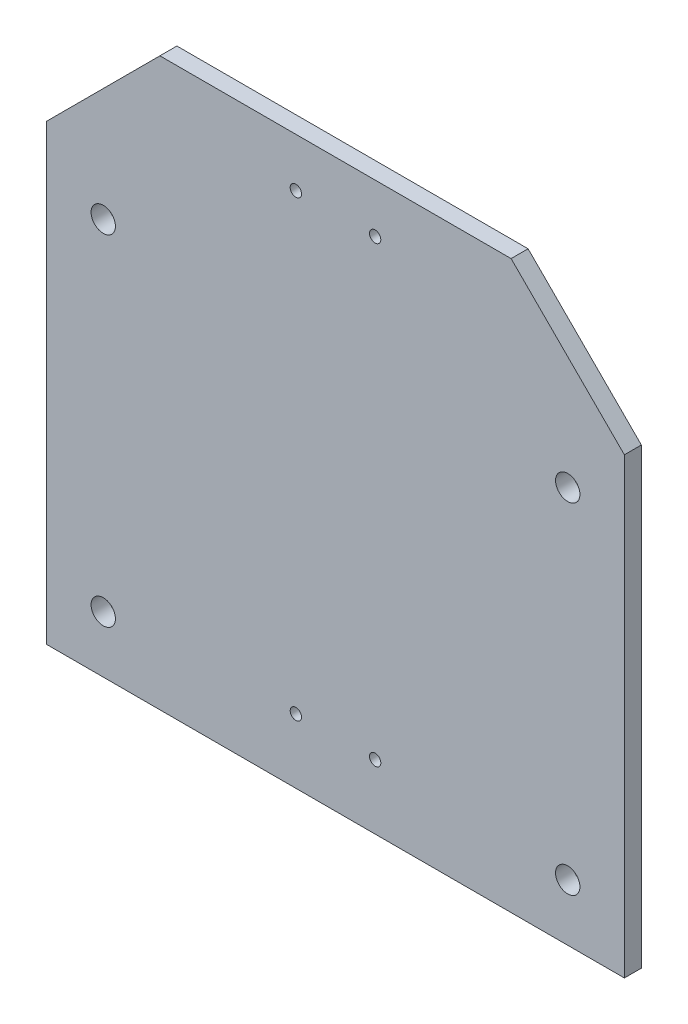
ISO-10303-21;
HEADER;
FILE_DESCRIPTION(('STEP AP214'),'2;1');
FILE_NAME('part.step','',(''),(''),'','','');
FILE_SCHEMA(('AUTOMOTIVE_DESIGN { 1 0 10303 214 1 1 1 1 }'));
ENDSEC;
DATA;
#1=APPLICATION_CONTEXT('core data for automotive mechanical design processes');
#2=APPLICATION_PROTOCOL_DEFINITION('international standard','automotive_design',2000,#1);
#3=PRODUCT_CONTEXT('',#1,'mechanical');
#4=PRODUCT('Part','Part','',(#3));
#5=PRODUCT_RELATED_PRODUCT_CATEGORY('part','',(#4));
#6=PRODUCT_DEFINITION_FORMATION('','',#4);
#7=PRODUCT_DEFINITION_CONTEXT('part definition',#1,'design');
#8=PRODUCT_DEFINITION('design','',#6,#7);
#9=PRODUCT_DEFINITION_SHAPE('','',#8);
#10=(LENGTH_UNIT() NAMED_UNIT(*) SI_UNIT(.MILLI.,.METRE.));
#11=(NAMED_UNIT(*) PLANE_ANGLE_UNIT() SI_UNIT($,.RADIAN.));
#12=(NAMED_UNIT(*) SI_UNIT($,.STERADIAN.) SOLID_ANGLE_UNIT());
#13=UNCERTAINTY_MEASURE_WITH_UNIT(LENGTH_MEASURE(1.E-05),#10,'distance_accuracy_value','');
#14=(GEOMETRIC_REPRESENTATION_CONTEXT(3) GLOBAL_UNCERTAINTY_ASSIGNED_CONTEXT((#13)) GLOBAL_UNIT_ASSIGNED_CONTEXT((#10,
#11,#12)) REPRESENTATION_CONTEXT('',''));
#15=CARTESIAN_POINT('',(0.,0.,0.));
#16=DIRECTION('',(0.,0.,1.));
#17=DIRECTION('',(1.,0.,0.));
#18=AXIS2_PLACEMENT_3D('',#15,#16,#17);
#19=CARTESIAN_POINT('',(-51.0025000000016,19.8724612873921,-3.));
#20=DIRECTION('',(-1.,-2.76341449723146E-13,0.));
#21=DIRECTION('',(2.76341449723146E-13,-1.,0.));
#22=AXIS2_PLACEMENT_3D('',#19,#20,#21);
#23=PLANE('',#22);
#24=DIRECTION('',(2.76341449723146E-13,-1.,0.));
#25=VECTOR('',#24,1.);
#26=CARTESIAN_POINT('',(-51.0025000000016,19.8724612873921,0.));
#27=LINE('',#26,#25);
#28=CARTESIAN_POINT('',(-51.0025000000016,19.8724612873921,0.));
#29=VERTEX_POINT('',#28);
#30=CARTESIAN_POINT('',(-51.0024999999795,-60.1275387125962,0.));
#31=VERTEX_POINT('',#30);
#32=EDGE_CURVE('E121',#29,#31,#27,.T.);
#33=ORIENTED_EDGE('',*,*,#32,.F.);
#34=DIRECTION('',(0.,0.,1.));
#35=VECTOR('',#34,1.);
#36=CARTESIAN_POINT('',(-51.0025000000016,19.8724612873921,-3.));
#37=LINE('',#36,#35);
#38=CARTESIAN_POINT('',(-51.0025000000016,19.8724612873921,-3.));
#39=VERTEX_POINT('',#38);
#40=EDGE_CURVE('E11',#39,#29,#37,.T.);
#41=ORIENTED_EDGE('',*,*,#40,.F.);
#42=DIRECTION('',(2.76341449723146E-13,-1.,0.));
#43=VECTOR('',#42,1.);
#44=CARTESIAN_POINT('',(-51.0025000000016,19.8724612873921,-3.));
#45=LINE('',#44,#43);
#46=CARTESIAN_POINT('',(-51.0024999999795,-60.1275387125962,-3.));
#47=VERTEX_POINT('',#46);
#48=EDGE_CURVE('E136',#39,#47,#45,.T.);
#49=ORIENTED_EDGE('',*,*,#48,.T.);
#50=DIRECTION('',(0.,0.,1.));
#51=VECTOR('',#50,1.);
#52=CARTESIAN_POINT('',(-51.0024999999795,-60.1275387125962,-3.));
#53=LINE('',#52,#51);
#54=EDGE_CURVE('E85',#47,#31,#53,.T.);
#55=ORIENTED_EDGE('',*,*,#54,.T.);
#56=EDGE_LOOP('',(#33,#41,#49,#55));
#57=FACE_BOUND('',#56,.T.);
#58=ADVANCED_FACE('F35',(#57),#23,.T.);
#59=CARTESIAN_POINT('',(-31.0025000000045,39.872461287395,-3.));
#60=DIRECTION('',(-0.707106781186647,0.707106781186448,0.));
#61=DIRECTION('',(-0.707106781186448,-0.707106781186647,0.));
#62=AXIS2_PLACEMENT_3D('',#59,#60,#61);
#63=PLANE('',#62);
#64=DIRECTION('',(-0.707106781186448,-0.707106781186647,0.));
#65=VECTOR('',#64,1.);
#66=CARTESIAN_POINT('',(-31.0025000000045,39.872461287395,0.));
#67=LINE('',#66,#65);
#68=CARTESIAN_POINT('',(-31.0025000000045,39.872461287395,0.));
#69=VERTEX_POINT('',#68);
#70=EDGE_CURVE('E134',#69,#29,#67,.T.);
#71=ORIENTED_EDGE('',*,*,#70,.F.);
#72=DIRECTION('',(0.,0.,1.));
#73=VECTOR('',#72,1.);
#74=CARTESIAN_POINT('',(-31.0025000000045,39.872461287395,-3.));
#75=LINE('',#74,#73);
#76=CARTESIAN_POINT('',(-31.0025000000045,39.872461287395,-3.));
#77=VERTEX_POINT('',#76);
#78=EDGE_CURVE('E44',#77,#69,#75,.T.);
#79=ORIENTED_EDGE('',*,*,#78,.F.);
#80=DIRECTION('',(-0.707106781186448,-0.707106781186647,0.));
#81=VECTOR('',#80,1.);
#82=CARTESIAN_POINT('',(-31.0025000000045,39.872461287395,-3.));
#83=LINE('',#82,#81);
#84=EDGE_CURVE('E111',#77,#39,#83,.T.);
#85=ORIENTED_EDGE('',*,*,#84,.T.);
#86=ORIENTED_EDGE('',*,*,#40,.T.);
#87=EDGE_LOOP('',(#71,#79,#85,#86));
#88=FACE_BOUND('',#87,.T.);
#89=ADVANCED_FACE('F187',(#88),#63,.T.);
#90=CARTESIAN_POINT('',(31.0024999999955,39.8724612874038,-3.));
#91=DIRECTION('',(-1.41900128540511E-13,1.,0.));
#92=DIRECTION('',(-1.,-1.41900128540511E-13,0.));
#93=AXIS2_PLACEMENT_3D('',#90,#91,#92);
#94=PLANE('',#93);
#95=DIRECTION('',(-1.,-1.41900128540511E-13,0.));
#96=VECTOR('',#95,1.);
#97=CARTESIAN_POINT('',(31.0024999999955,39.8724612874038,0.));
#98=LINE('',#97,#96);
#99=CARTESIAN_POINT('',(31.0024999999955,39.8724612874038,0.));
#100=VERTEX_POINT('',#99);
#101=EDGE_CURVE('E98',#100,#69,#98,.T.);
#102=ORIENTED_EDGE('',*,*,#101,.F.);
#103=DIRECTION('',(0.,0.,1.));
#104=VECTOR('',#103,1.);
#105=CARTESIAN_POINT('',(31.0024999999955,39.8724612874038,-3.));
#106=LINE('',#105,#104);
#107=CARTESIAN_POINT('',(31.0024999999955,39.8724612874038,-3.));
#108=VERTEX_POINT('',#107);
#109=EDGE_CURVE('E93',#108,#100,#106,.T.);
#110=ORIENTED_EDGE('',*,*,#109,.F.);
#111=DIRECTION('',(-1.,-1.41900128540511E-13,0.));
#112=VECTOR('',#111,1.);
#113=CARTESIAN_POINT('',(31.0024999999955,39.8724612874038,-3.));
#114=LINE('',#113,#112);
#115=EDGE_CURVE('E96',#108,#77,#114,.T.);
#116=ORIENTED_EDGE('',*,*,#115,.T.);
#117=ORIENTED_EDGE('',*,*,#78,.T.);
#118=EDGE_LOOP('',(#102,#110,#116,#117));
#119=FACE_BOUND('',#118,.T.);
#120=ADVANCED_FACE('F95',(#119),#94,.T.);
#121=CARTESIAN_POINT('',(51.0024999999983,19.8724612874066,-3.));
#122=DIRECTION('',(0.707106781186447,0.707106781186648,0.));
#123=DIRECTION('',(-0.707106781186648,0.707106781186447,0.));
#124=AXIS2_PLACEMENT_3D('',#121,#122,#123);
#125=PLANE('',#124);
#126=DIRECTION('',(-0.707106781186648,0.707106781186447,0.));
#127=VECTOR('',#126,1.);
#128=CARTESIAN_POINT('',(51.0024999999983,19.8724612874066,0.));
#129=LINE('',#128,#127);
#130=CARTESIAN_POINT('',(51.0024999999983,19.8724612874066,0.));
#131=VERTEX_POINT('',#130);
#132=EDGE_CURVE('E131',#131,#100,#129,.T.);
#133=ORIENTED_EDGE('',*,*,#132,.F.);
#134=DIRECTION('',(0.,0.,1.));
#135=VECTOR('',#134,1.);
#136=CARTESIAN_POINT('',(51.0024999999983,19.8724612874066,-3.));
#137=LINE('',#136,#135);
#138=CARTESIAN_POINT('',(51.0024999999983,19.8724612874066,-3.));
#139=VERTEX_POINT('',#138);
#140=EDGE_CURVE('E103',#139,#131,#137,.T.);
#141=ORIENTED_EDGE('',*,*,#140,.F.);
#142=DIRECTION('',(-0.707106781186648,0.707106781186447,0.));
#143=VECTOR('',#142,1.);
#144=CARTESIAN_POINT('',(51.0024999999983,19.8724612874066,-3.));
#145=LINE('',#144,#143);
#146=EDGE_CURVE('E109',#139,#108,#145,.T.);
#147=ORIENTED_EDGE('',*,*,#146,.T.);
#148=ORIENTED_EDGE('',*,*,#109,.T.);
#149=EDGE_LOOP('',(#133,#141,#147,#148));
#150=FACE_BOUND('',#149,.T.);
#151=ADVANCED_FACE('F113',(#150),#125,.T.);
#152=CARTESIAN_POINT('',(51.0024999999983,-60.1275387125962,-3.));
#153=DIRECTION('',(1.,0.,0.));
#154=DIRECTION('',(0.,0.,-1.));
#155=AXIS2_PLACEMENT_3D('',#152,#153,#154);
#156=PLANE('',#155);
#157=DIRECTION('',(0.,1.,0.));
#158=VECTOR('',#157,1.);
#159=CARTESIAN_POINT('',(51.0024999999983,-60.1275387125962,0.));
#160=LINE('',#159,#158);
#161=CARTESIAN_POINT('',(51.0024999999983,-60.1275387125962,0.));
#162=VERTEX_POINT('',#161);
#163=EDGE_CURVE('E128',#162,#131,#160,.T.);
#164=ORIENTED_EDGE('',*,*,#163,.F.);
#165=DIRECTION('',(0.,0.,1.));
#166=VECTOR('',#165,1.);
#167=CARTESIAN_POINT('',(51.0024999999983,-60.1275387125962,-3.));
#168=LINE('',#167,#166);
#169=CARTESIAN_POINT('',(51.0024999999983,-60.1275387125962,-3.));
#170=VERTEX_POINT('',#169);
#171=EDGE_CURVE('E140',#170,#162,#168,.T.);
#172=ORIENTED_EDGE('',*,*,#171,.F.);
#173=DIRECTION('',(0.,1.,0.));
#174=VECTOR('',#173,1.);
#175=CARTESIAN_POINT('',(51.0024999999983,-60.1275387125962,-3.));
#176=LINE('',#175,#174);
#177=EDGE_CURVE('E114',#170,#139,#176,.T.);
#178=ORIENTED_EDGE('',*,*,#177,.T.);
#179=ORIENTED_EDGE('',*,*,#140,.T.);
#180=EDGE_LOOP('',(#164,#172,#178,#179));
#181=FACE_BOUND('',#180,.T.);
#182=ADVANCED_FACE('F200',(#181),#156,.T.);
#183=CARTESIAN_POINT('',(-51.0024999999795,-60.1275387125962,-3.));
#184=DIRECTION('',(0.,-1.,0.));
#185=DIRECTION('',(0.,0.,-1.));
#186=AXIS2_PLACEMENT_3D('',#183,#184,#185);
#187=PLANE('',#186);
#188=DIRECTION('',(1.,0.,0.));
#189=VECTOR('',#188,1.);
#190=CARTESIAN_POINT('',(-51.0024999999795,-60.1275387125962,0.));
#191=LINE('',#190,#189);
#192=EDGE_CURVE('E124',#31,#162,#191,.T.);
#193=ORIENTED_EDGE('',*,*,#192,.F.);
#194=ORIENTED_EDGE('',*,*,#54,.F.);
#195=DIRECTION('',(1.,0.,0.));
#196=VECTOR('',#195,1.);
#197=CARTESIAN_POINT('',(-51.0024999999795,-60.1275387125962,-3.));
#198=LINE('',#197,#196);
#199=EDGE_CURVE('E116',#47,#170,#198,.T.);
#200=ORIENTED_EDGE('',*,*,#199,.T.);
#201=ORIENTED_EDGE('',*,*,#171,.T.);
#202=EDGE_LOOP('',(#193,#194,#200,#201));
#203=FACE_BOUND('',#202,.T.);
#204=ADVANCED_FACE('F183',(#203),#187,.T.);
#205=CARTESIAN_POINT('',(0.,0.,-3.));
#206=DIRECTION('',(0.,0.,1.));
#207=DIRECTION('',(1.,0.,0.));
#208=AXIS2_PLACEMENT_3D('',#205,#206,#207);
#209=PLANE('',#208);
#210=CARTESIAN_POINT('',(-6.99983400000003,31.2499999999999,-3.));
#211=DIRECTION('',(0.,0.,-1.));
#212=DIRECTION('',(-1.,0.,0.));
#213=AXIS2_PLACEMENT_3D('',#210,#211,#212);
#214=CIRCLE('',#213,0.99999999991944);
#215=CARTESIAN_POINT('',(-7.99983399991947,31.2499999999999,-3.));
#216=VERTEX_POINT('',#215);
#217=EDGE_CURVE('E255',#216,#216,#214,.T.);
#218=ORIENTED_EDGE('',*,*,#217,.F.);
#219=EDGE_LOOP('',(#218));
#220=FACE_BOUND('',#219,.T.);
#221=CARTESIAN_POINT('',(7.00016599999998,-48.7500000000001,-3.));
#222=DIRECTION('',(0.,0.,-1.));
#223=DIRECTION('',(-1.,0.,0.));
#224=AXIS2_PLACEMENT_3D('',#221,#222,#223);
#225=CIRCLE('',#224,0.999999999926217);
#226=CARTESIAN_POINT('',(6.00016600007376,-48.7500000000001,-3.));
#227=VERTEX_POINT('',#226);
#228=EDGE_CURVE('E252',#227,#227,#225,.T.);
#229=ORIENTED_EDGE('',*,*,#228,.F.);
#230=EDGE_LOOP('',(#229));
#231=FACE_BOUND('',#230,.T.);
#232=CARTESIAN_POINT('',(-6.99983400000002,-48.7500000000001,-3.));
#233=DIRECTION('',(0.,0.,-1.));
#234=DIRECTION('',(-1.,0.,0.));
#235=AXIS2_PLACEMENT_3D('',#232,#233,#234);
#236=CIRCLE('',#235,0.999999999926601);
#237=CARTESIAN_POINT('',(-7.99983399992662,-48.7500000000001,-3.));
#238=VERTEX_POINT('',#237);
#239=EDGE_CURVE('E250',#238,#238,#236,.T.);
#240=ORIENTED_EDGE('',*,*,#239,.F.);
#241=EDGE_LOOP('',(#240));
#242=FACE_BOUND('',#241,.T.);
#243=CARTESIAN_POINT('',(7.00016599999997,31.2499999999999,-3.));
#244=DIRECTION('',(0.,0.,-1.));
#245=DIRECTION('',(-1.,0.,0.));
#246=AXIS2_PLACEMENT_3D('',#243,#244,#245);
#247=CIRCLE('',#246,0.999999999919061);
#248=CARTESIAN_POINT('',(6.00016600008091,31.2499999999999,-3.));
#249=VERTEX_POINT('',#248);
#250=EDGE_CURVE('E147',#249,#249,#247,.T.);
#251=ORIENTED_EDGE('',*,*,#250,.F.);
#252=EDGE_LOOP('',(#251));
#253=FACE_BOUND('',#252,.T.);
#254=CARTESIAN_POINT('',(-41.0024999999928,-50.1275387126067,-3.));
#255=DIRECTION('',(0.,0.,1.));
#256=DIRECTION('',(1.,0.,0.));
#257=AXIS2_PLACEMENT_3D('',#254,#255,#256);
#258=CIRCLE('',#257,2.15000000000114);
#259=CARTESIAN_POINT('',(-38.8524999999917,-50.1275387126067,-3.));
#260=VERTEX_POINT('',#259);
#261=EDGE_CURVE('E167',#260,#260,#258,.T.);
#262=ORIENTED_EDGE('',*,*,#261,.T.);
#263=EDGE_LOOP('',(#262));
#264=FACE_BOUND('',#263,.T.);
#265=CARTESIAN_POINT('',(41.0024999999989,9.87246128740452,-3.));
#266=DIRECTION('',(0.,0.,1.));
#267=DIRECTION('',(1.,0.,0.));
#268=AXIS2_PLACEMENT_3D('',#265,#266,#267);
#269=CIRCLE('',#268,2.15000000000101);
#270=CARTESIAN_POINT('',(43.1524999999999,9.87246128740452,-3.));
#271=VERTEX_POINT('',#270);
#272=EDGE_CURVE('E174',#271,#271,#269,.T.);
#273=ORIENTED_EDGE('',*,*,#272,.T.);
#274=EDGE_LOOP('',(#273));
#275=FACE_BOUND('',#274,.T.);
#276=CARTESIAN_POINT('',(41.0025000000072,-50.1275387125955,-3.));
#277=DIRECTION('',(0.,0.,1.));
#278=DIRECTION('',(1.,0.,0.));
#279=AXIS2_PLACEMENT_3D('',#276,#277,#278);
#280=CIRCLE('',#279,2.15000000000125);
#281=CARTESIAN_POINT('',(43.1525000000084,-50.1275387125955,-3.));
#282=VERTEX_POINT('',#281);
#283=EDGE_CURVE('E158',#282,#282,#280,.T.);
#284=ORIENTED_EDGE('',*,*,#283,.T.);
#285=EDGE_LOOP('',(#284));
#286=FACE_BOUND('',#285,.T.);
#287=CARTESIAN_POINT('',(-41.0025000000011,9.87246128739327,-3.));
#288=DIRECTION('',(0.,0.,1.));
#289=DIRECTION('',(1.,0.,0.));
#290=AXIS2_PLACEMENT_3D('',#287,#288,#289);
#291=CIRCLE('',#290,2.1500000000009);
#292=CARTESIAN_POINT('',(-38.8525000000002,9.87246128739327,-3.));
#293=VERTEX_POINT('',#292);
#294=EDGE_CURVE('E125',#293,#293,#291,.T.);
#295=ORIENTED_EDGE('',*,*,#294,.T.);
#296=EDGE_LOOP('',(#295));
#297=FACE_BOUND('',#296,.T.);
#298=ORIENTED_EDGE('',*,*,#48,.F.);
#299=ORIENTED_EDGE('',*,*,#84,.F.);
#300=ORIENTED_EDGE('',*,*,#115,.F.);
#301=ORIENTED_EDGE('',*,*,#146,.F.);
#302=ORIENTED_EDGE('',*,*,#177,.F.);
#303=ORIENTED_EDGE('',*,*,#199,.F.);
#304=EDGE_LOOP('',(#298,#299,#300,#301,#302,#303));
#305=FACE_BOUND('',#304,.T.);
#306=ADVANCED_FACE('F107',(#220,#231,#242,#253,#264,#275,#286,#297,#305),#209,.F.);
#307=CARTESIAN_POINT('',(0.,0.,0.));
#308=DIRECTION('',(0.,0.,1.));
#309=DIRECTION('',(1.,0.,0.));
#310=AXIS2_PLACEMENT_3D('',#307,#308,#309);
#311=PLANE('',#310);
#312=CARTESIAN_POINT('',(-6.99983400000003,31.2499999999999,0.));
#313=DIRECTION('',(0.,0.,1.));
#314=DIRECTION('',(1.,0.,0.));
#315=AXIS2_PLACEMENT_3D('',#312,#313,#314);
#316=CIRCLE('',#315,0.99999999991944);
#317=CARTESIAN_POINT('',(-5.99983400008059,31.2499999999999,0.));
#318=VERTEX_POINT('',#317);
#319=EDGE_CURVE('E38',#318,#318,#316,.T.);
#320=ORIENTED_EDGE('',*,*,#319,.F.);
#321=EDGE_LOOP('',(#320));
#322=FACE_BOUND('',#321,.T.);
#323=CARTESIAN_POINT('',(7.00016599999998,-48.7500000000001,0.));
#324=DIRECTION('',(0.,0.,1.));
#325=DIRECTION('',(1.,0.,0.));
#326=AXIS2_PLACEMENT_3D('',#323,#324,#325);
#327=CIRCLE('',#326,0.999999999926217);
#328=CARTESIAN_POINT('',(8.0001659999262,-48.7500000000001,0.));
#329=VERTEX_POINT('',#328);
#330=EDGE_CURVE('E149',#329,#329,#327,.T.);
#331=ORIENTED_EDGE('',*,*,#330,.F.);
#332=EDGE_LOOP('',(#331));
#333=FACE_BOUND('',#332,.T.);
#334=CARTESIAN_POINT('',(-6.99983400000002,-48.7500000000001,0.));
#335=DIRECTION('',(0.,0.,1.));
#336=DIRECTION('',(1.,0.,0.));
#337=AXIS2_PLACEMENT_3D('',#334,#335,#336);
#338=CIRCLE('',#337,0.999999999926601);
#339=CARTESIAN_POINT('',(-5.99983400007342,-48.7500000000001,0.));
#340=VERTEX_POINT('',#339);
#341=EDGE_CURVE('E146',#340,#340,#338,.T.);
#342=ORIENTED_EDGE('',*,*,#341,.F.);
#343=EDGE_LOOP('',(#342));
#344=FACE_BOUND('',#343,.T.);
#345=CARTESIAN_POINT('',(7.00016599999997,31.2499999999999,0.));
#346=DIRECTION('',(0.,0.,1.));
#347=DIRECTION('',(1.,0.,0.));
#348=AXIS2_PLACEMENT_3D('',#345,#346,#347);
#349=CIRCLE('',#348,0.999999999919061);
#350=CARTESIAN_POINT('',(8.00016599991903,31.2499999999999,0.));
#351=VERTEX_POINT('',#350);
#352=EDGE_CURVE('E143',#351,#351,#349,.T.);
#353=ORIENTED_EDGE('',*,*,#352,.F.);
#354=EDGE_LOOP('',(#353));
#355=FACE_BOUND('',#354,.T.);
#356=CARTESIAN_POINT('',(-41.0024999999928,-50.1275387126067,0.));
#357=DIRECTION('',(0.,0.,1.));
#358=DIRECTION('',(1.,0.,0.));
#359=AXIS2_PLACEMENT_3D('',#356,#357,#358);
#360=CIRCLE('',#359,2.15000000000114);
#361=CARTESIAN_POINT('',(-38.8524999999917,-50.1275387126067,0.));
#362=VERTEX_POINT('',#361);
#363=EDGE_CURVE('E171',#362,#362,#360,.T.);
#364=ORIENTED_EDGE('',*,*,#363,.F.);
#365=EDGE_LOOP('',(#364));
#366=FACE_BOUND('',#365,.T.);
#367=CARTESIAN_POINT('',(41.0024999999989,9.87246128740452,0.));
#368=DIRECTION('',(0.,0.,1.));
#369=DIRECTION('',(1.,0.,0.));
#370=AXIS2_PLACEMENT_3D('',#367,#368,#369);
#371=CIRCLE('',#370,2.15000000000101);
#372=CARTESIAN_POINT('',(43.1524999999999,9.87246128740452,0.));
#373=VERTEX_POINT('',#372);
#374=EDGE_CURVE('E163',#373,#373,#371,.T.);
#375=ORIENTED_EDGE('',*,*,#374,.F.);
#376=EDGE_LOOP('',(#375));
#377=FACE_BOUND('',#376,.T.);
#378=CARTESIAN_POINT('',(41.0025000000072,-50.1275387125955,0.));
#379=DIRECTION('',(0.,0.,1.));
#380=DIRECTION('',(1.,0.,0.));
#381=AXIS2_PLACEMENT_3D('',#378,#379,#380);
#382=CIRCLE('',#381,2.15000000000125);
#383=CARTESIAN_POINT('',(43.1525000000084,-50.1275387125955,0.));
#384=VERTEX_POINT('',#383);
#385=EDGE_CURVE('E154',#384,#384,#382,.T.);
#386=ORIENTED_EDGE('',*,*,#385,.F.);
#387=EDGE_LOOP('',(#386));
#388=FACE_BOUND('',#387,.T.);
#389=CARTESIAN_POINT('',(-41.0025000000011,9.87246128739327,0.));
#390=DIRECTION('',(0.,0.,1.));
#391=DIRECTION('',(1.,0.,0.));
#392=AXIS2_PLACEMENT_3D('',#389,#390,#391);
#393=CIRCLE('',#392,2.1500000000009);
#394=CARTESIAN_POINT('',(-38.8525000000002,9.87246128739327,0.));
#395=VERTEX_POINT('',#394);
#396=EDGE_CURVE('E170',#395,#395,#393,.T.);
#397=ORIENTED_EDGE('',*,*,#396,.F.);
#398=EDGE_LOOP('',(#397));
#399=FACE_BOUND('',#398,.T.);
#400=ORIENTED_EDGE('',*,*,#32,.T.);
#401=ORIENTED_EDGE('',*,*,#192,.T.);
#402=ORIENTED_EDGE('',*,*,#163,.T.);
#403=ORIENTED_EDGE('',*,*,#132,.T.);
#404=ORIENTED_EDGE('',*,*,#101,.T.);
#405=ORIENTED_EDGE('',*,*,#70,.T.);
#406=EDGE_LOOP('',(#400,#401,#402,#403,#404,#405));
#407=FACE_BOUND('',#406,.T.);
#408=ADVANCED_FACE('F186',(#322,#333,#344,#355,#366,#377,#388,#399,#407),#311,.T.);
#409=CARTESIAN_POINT('',(-41.0025000000011,9.87246128739327,-3.));
#410=DIRECTION('',(0.,0.,1.));
#411=DIRECTION('',(1.,0.,0.));
#412=AXIS2_PLACEMENT_3D('',#409,#410,#411);
#413=CYLINDRICAL_SURFACE('',#412,2.1500000000009);
#414=ORIENTED_EDGE('',*,*,#294,.F.);
#415=EDGE_LOOP('',(#414));
#416=FACE_BOUND('',#415,.T.);
#417=ORIENTED_EDGE('',*,*,#396,.T.);
#418=EDGE_LOOP('',(#417));
#419=FACE_BOUND('',#418,.T.);
#420=ADVANCED_FACE('F211',(#416,#419),#413,.F.);
#421=CARTESIAN_POINT('',(41.0025000000072,-50.1275387125955,-3.));
#422=DIRECTION('',(0.,0.,1.));
#423=DIRECTION('',(1.,0.,0.));
#424=AXIS2_PLACEMENT_3D('',#421,#422,#423);
#425=CYLINDRICAL_SURFACE('',#424,2.15000000000125);
#426=ORIENTED_EDGE('',*,*,#283,.F.);
#427=EDGE_LOOP('',(#426));
#428=FACE_BOUND('',#427,.T.);
#429=ORIENTED_EDGE('',*,*,#385,.T.);
#430=EDGE_LOOP('',(#429));
#431=FACE_BOUND('',#430,.T.);
#432=ADVANCED_FACE('F218',(#428,#431),#425,.F.);
#433=CARTESIAN_POINT('',(41.0024999999989,9.87246128740452,-3.));
#434=DIRECTION('',(0.,0.,1.));
#435=DIRECTION('',(1.,0.,0.));
#436=AXIS2_PLACEMENT_3D('',#433,#434,#435);
#437=CYLINDRICAL_SURFACE('',#436,2.15000000000101);
#438=ORIENTED_EDGE('',*,*,#272,.F.);
#439=EDGE_LOOP('',(#438));
#440=FACE_BOUND('',#439,.T.);
#441=ORIENTED_EDGE('',*,*,#374,.T.);
#442=EDGE_LOOP('',(#441));
#443=FACE_BOUND('',#442,.T.);
#444=ADVANCED_FACE('F220',(#440,#443),#437,.F.);
#445=CARTESIAN_POINT('',(-41.0024999999928,-50.1275387126067,-3.));
#446=DIRECTION('',(0.,0.,1.));
#447=DIRECTION('',(1.,0.,0.));
#448=AXIS2_PLACEMENT_3D('',#445,#446,#447);
#449=CYLINDRICAL_SURFACE('',#448,2.15000000000114);
#450=ORIENTED_EDGE('',*,*,#261,.F.);
#451=EDGE_LOOP('',(#450));
#452=FACE_BOUND('',#451,.T.);
#453=ORIENTED_EDGE('',*,*,#363,.T.);
#454=EDGE_LOOP('',(#453));
#455=FACE_BOUND('',#454,.T.);
#456=ADVANCED_FACE('F223',(#452,#455),#449,.F.);
#457=CARTESIAN_POINT('',(7.00016599999997,31.2499999999999,67.));
#458=DIRECTION('',(0.,0.,-1.));
#459=DIRECTION('',(-1.,0.,0.));
#460=AXIS2_PLACEMENT_3D('',#457,#458,#459);
#461=CYLINDRICAL_SURFACE('',#460,0.999999999919061);
#462=ORIENTED_EDGE('',*,*,#352,.T.);
#463=EDGE_LOOP('',(#462));
#464=FACE_BOUND('',#463,.T.);
#465=ORIENTED_EDGE('',*,*,#250,.T.);
#466=EDGE_LOOP('',(#465));
#467=FACE_BOUND('',#466,.T.);
#468=ADVANCED_FACE('F227',(#464,#467),#461,.F.);
#469=CARTESIAN_POINT('',(-6.99983400000002,-48.7500000000001,67.));
#470=DIRECTION('',(0.,0.,-1.));
#471=DIRECTION('',(-1.,0.,0.));
#472=AXIS2_PLACEMENT_3D('',#469,#470,#471);
#473=CYLINDRICAL_SURFACE('',#472,0.999999999926601);
#474=ORIENTED_EDGE('',*,*,#341,.T.);
#475=EDGE_LOOP('',(#474));
#476=FACE_BOUND('',#475,.T.);
#477=ORIENTED_EDGE('',*,*,#239,.T.);
#478=EDGE_LOOP('',(#477));
#479=FACE_BOUND('',#478,.T.);
#480=ADVANCED_FACE('F234',(#476,#479),#473,.F.);
#481=CARTESIAN_POINT('',(7.00016599999998,-48.7500000000001,67.));
#482=DIRECTION('',(0.,0.,-1.));
#483=DIRECTION('',(-1.,0.,0.));
#484=AXIS2_PLACEMENT_3D('',#481,#482,#483);
#485=CYLINDRICAL_SURFACE('',#484,0.999999999926217);
#486=ORIENTED_EDGE('',*,*,#330,.T.);
#487=EDGE_LOOP('',(#486));
#488=FACE_BOUND('',#487,.T.);
#489=ORIENTED_EDGE('',*,*,#228,.T.);
#490=EDGE_LOOP('',(#489));
#491=FACE_BOUND('',#490,.T.);
#492=ADVANCED_FACE('F236',(#488,#491),#485,.F.);
#493=CARTESIAN_POINT('',(-6.99983400000003,31.2499999999999,67.));
#494=DIRECTION('',(0.,0.,-1.));
#495=DIRECTION('',(-1.,0.,0.));
#496=AXIS2_PLACEMENT_3D('',#493,#494,#495);
#497=CYLINDRICAL_SURFACE('',#496,0.99999999991944);
#498=ORIENTED_EDGE('',*,*,#319,.T.);
#499=EDGE_LOOP('',(#498));
#500=FACE_BOUND('',#499,.T.);
#501=ORIENTED_EDGE('',*,*,#217,.T.);
#502=EDGE_LOOP('',(#501));
#503=FACE_BOUND('',#502,.T.);
#504=ADVANCED_FACE('F239',(#500,#503),#497,.F.);
#505=CLOSED_SHELL('',(#58,#89,#120,#151,#182,#204,#306,#408,#420,#432,#444,#456,#468,#480,#492,#504));
#506=MANIFOLD_SOLID_BREP('B2',#505);
#507=ADVANCED_BREP_SHAPE_REPRESENTATION('',(#18,#506),#14);
#508=SHAPE_DEFINITION_REPRESENTATION(#9,#507);
ENDSEC;
END-ISO-10303-21;
